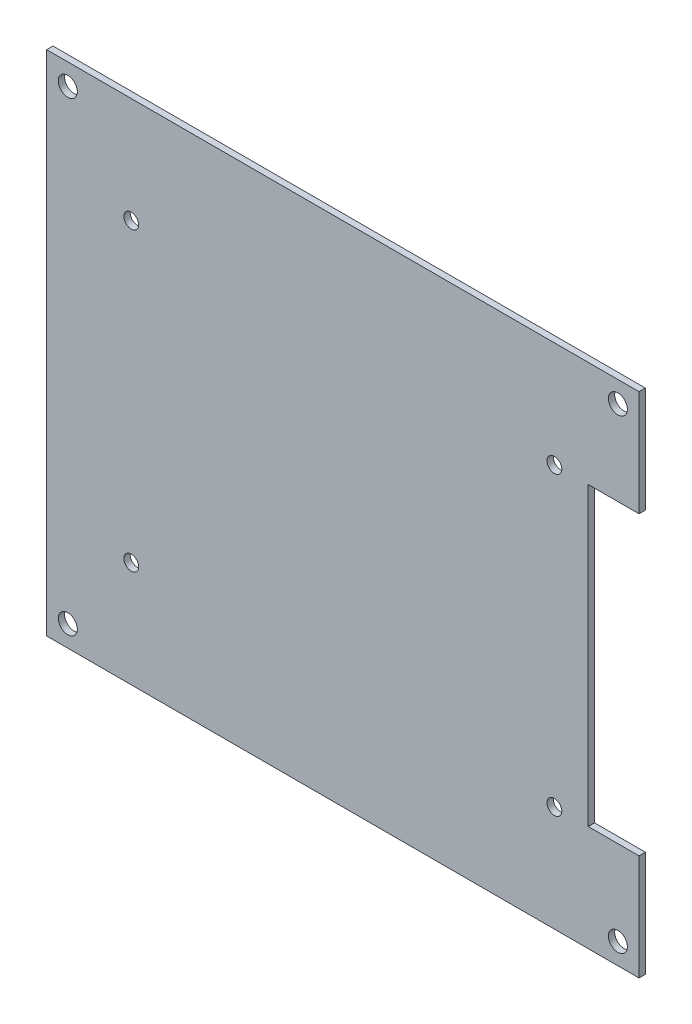
ISO-10303-21;
HEADER;
FILE_DESCRIPTION(('STEP AP214'),'2;1');
FILE_NAME('part.step','',(''),(''),'','','');
FILE_SCHEMA(('AUTOMOTIVE_DESIGN { 1 0 10303 214 1 1 1 1 }'));
ENDSEC;
DATA;
#1=APPLICATION_CONTEXT('core data for automotive mechanical design processes');
#2=APPLICATION_PROTOCOL_DEFINITION('international standard','automotive_design',2000,#1);
#3=PRODUCT_CONTEXT('',#1,'mechanical');
#4=PRODUCT('Part','Part','',(#3));
#5=PRODUCT_RELATED_PRODUCT_CATEGORY('part','',(#4));
#6=PRODUCT_DEFINITION_FORMATION('','',#4);
#7=PRODUCT_DEFINITION_CONTEXT('part definition',#1,'design');
#8=PRODUCT_DEFINITION('design','',#6,#7);
#9=PRODUCT_DEFINITION_SHAPE('','',#8);
#10=(LENGTH_UNIT() NAMED_UNIT(*) SI_UNIT(.MILLI.,.METRE.));
#11=(NAMED_UNIT(*) PLANE_ANGLE_UNIT() SI_UNIT($,.RADIAN.));
#12=(NAMED_UNIT(*) SI_UNIT($,.STERADIAN.) SOLID_ANGLE_UNIT());
#13=UNCERTAINTY_MEASURE_WITH_UNIT(LENGTH_MEASURE(1.E-05),#10,'distance_accuracy_value','');
#14=(GEOMETRIC_REPRESENTATION_CONTEXT(3) GLOBAL_UNCERTAINTY_ASSIGNED_CONTEXT((#13)) GLOBAL_UNIT_ASSIGNED_CONTEXT((#10,
#11,#12)) REPRESENTATION_CONTEXT('',''));
#15=CARTESIAN_POINT('',(0.,0.,0.));
#16=DIRECTION('',(0.,0.,1.));
#17=DIRECTION('',(1.,0.,0.));
#18=AXIS2_PLACEMENT_3D('',#15,#16,#17);
#19=CARTESIAN_POINT('',(70.,-60.,1.5));
#20=DIRECTION('',(-1.,0.,0.));
#21=DIRECTION('',(0.,-1.,0.));
#22=AXIS2_PLACEMENT_3D('',#19,#20,#21);
#23=PLANE('',#22);
#24=DIRECTION('',(0.,1.,0.));
#25=VECTOR('',#24,1.);
#26=CARTESIAN_POINT('',(70.,-60.,0.));
#27=LINE('',#26,#25);
#28=CARTESIAN_POINT('',(70.,-60.,0.));
#29=VERTEX_POINT('',#28);
#30=CARTESIAN_POINT('',(70.,-35.,0.));
#31=VERTEX_POINT('',#30);
#32=EDGE_CURVE('E193',#29,#31,#27,.T.);
#33=ORIENTED_EDGE('',*,*,#32,.T.);
#34=DIRECTION('',(0.,0.,1.));
#35=VECTOR('',#34,1.);
#36=CARTESIAN_POINT('',(70.,-35.,1.5));
#37=LINE('',#36,#35);
#38=CARTESIAN_POINT('',(70.,-35.,1.5));
#39=VERTEX_POINT('',#38);
#40=EDGE_CURVE('E38',#31,#39,#37,.T.);
#41=ORIENTED_EDGE('',*,*,#40,.T.);
#42=DIRECTION('',(0.,1.,0.));
#43=VECTOR('',#42,1.);
#44=CARTESIAN_POINT('',(70.,-60.,1.5));
#45=LINE('',#44,#43);
#46=CARTESIAN_POINT('',(70.,-60.,1.5));
#47=VERTEX_POINT('',#46);
#48=EDGE_CURVE('E184',#47,#39,#45,.T.);
#49=ORIENTED_EDGE('',*,*,#48,.F.);
#50=DIRECTION('',(0.,0.,-1.));
#51=VECTOR('',#50,1.);
#52=CARTESIAN_POINT('',(70.,-60.,1.5));
#53=LINE('',#52,#51);
#54=EDGE_CURVE('E200',#47,#29,#53,.T.);
#55=ORIENTED_EDGE('',*,*,#54,.T.);
#56=EDGE_LOOP('',(#33,#41,#49,#55));
#57=FACE_BOUND('',#56,.T.);
#58=ADVANCED_FACE('F30',(#57),#23,.F.);
#59=CARTESIAN_POINT('',(-70.,60.,1.5));
#60=DIRECTION('',(0.,0.,-1.));
#61=DIRECTION('',(-1.,0.,0.));
#62=AXIS2_PLACEMENT_3D('',#59,#60,#61);
#63=PLANE('',#62);
#64=CARTESIAN_POINT('',(50.,35.,1.5));
#65=DIRECTION('',(0.,0.,1.));
#66=DIRECTION('',(1.,0.,0.));
#67=AXIS2_PLACEMENT_3D('',#64,#65,#66);
#68=CIRCLE('',#67,1.75);
#69=CARTESIAN_POINT('',(51.75,35.,1.5));
#70=VERTEX_POINT('',#69);
#71=EDGE_CURVE('E138',#70,#70,#68,.T.);
#72=ORIENTED_EDGE('',*,*,#71,.F.);
#73=EDGE_LOOP('',(#72));
#74=FACE_BOUND('',#73,.T.);
#75=CARTESIAN_POINT('',(-50.,35.,1.5));
#76=DIRECTION('',(0.,0.,1.));
#77=DIRECTION('',(1.,0.,0.));
#78=AXIS2_PLACEMENT_3D('',#75,#76,#77);
#79=CIRCLE('',#78,1.75);
#80=CARTESIAN_POINT('',(-48.25,35.,1.5));
#81=VERTEX_POINT('',#80);
#82=EDGE_CURVE('E150',#81,#81,#79,.T.);
#83=ORIENTED_EDGE('',*,*,#82,.F.);
#84=EDGE_LOOP('',(#83));
#85=FACE_BOUND('',#84,.T.);
#86=CARTESIAN_POINT('',(65.0000000000001,-55.,1.5));
#87=DIRECTION('',(0.,0.,1.));
#88=DIRECTION('',(1.,0.,0.));
#89=AXIS2_PLACEMENT_3D('',#86,#87,#88);
#90=CIRCLE('',#89,2.25);
#91=CARTESIAN_POINT('',(67.2500000000001,-55.,1.5));
#92=VERTEX_POINT('',#91);
#93=EDGE_CURVE('E162',#92,#92,#90,.T.);
#94=ORIENTED_EDGE('',*,*,#93,.F.);
#95=EDGE_LOOP('',(#94));
#96=FACE_BOUND('',#95,.T.);
#97=CARTESIAN_POINT('',(-65.,55.,1.5));
#98=DIRECTION('',(0.,0.,1.));
#99=DIRECTION('',(1.,0.,0.));
#100=AXIS2_PLACEMENT_3D('',#97,#98,#99);
#101=CIRCLE('',#100,2.25);
#102=CARTESIAN_POINT('',(-62.75,55.,1.5));
#103=VERTEX_POINT('',#102);
#104=EDGE_CURVE('E174',#103,#103,#101,.T.);
#105=ORIENTED_EDGE('',*,*,#104,.F.);
#106=EDGE_LOOP('',(#105));
#107=FACE_BOUND('',#106,.T.);
#108=ORIENTED_EDGE('',*,*,#48,.T.);
#109=DIRECTION('',(1.,0.,0.));
#110=VECTOR('',#109,1.);
#111=CARTESIAN_POINT('',(79.1241687514701,-35.,1.5));
#112=LINE('',#111,#110);
#113=CARTESIAN_POINT('',(58.,-35.,1.5));
#114=VERTEX_POINT('',#113);
#115=EDGE_CURVE('E113',#114,#39,#112,.T.);
#116=ORIENTED_EDGE('',*,*,#115,.F.);
#117=DIRECTION('',(0.,-1.,0.));
#118=VECTOR('',#117,1.);
#119=CARTESIAN_POINT('',(58.,-35.,1.5));
#120=LINE('',#119,#118);
#121=CARTESIAN_POINT('',(58.,35.,1.5));
#122=VERTEX_POINT('',#121);
#123=EDGE_CURVE('E109',#122,#114,#120,.T.);
#124=ORIENTED_EDGE('',*,*,#123,.F.);
#125=DIRECTION('',(-1.,0.,0.));
#126=VECTOR('',#125,1.);
#127=CARTESIAN_POINT('',(79.1241687514701,35.,1.5));
#128=LINE('',#127,#126);
#129=CARTESIAN_POINT('',(70.,35.,1.5));
#130=VERTEX_POINT('',#129);
#131=EDGE_CURVE('E116',#130,#122,#128,.T.);
#132=ORIENTED_EDGE('',*,*,#131,.F.);
#133=CARTESIAN_POINT('',(70.,60.,1.5));
#134=VERTEX_POINT('',#133);
#135=EDGE_CURVE('E183',#130,#134,#45,.T.);
#136=ORIENTED_EDGE('',*,*,#135,.T.);
#137=DIRECTION('',(-1.,0.,0.));
#138=VECTOR('',#137,1.);
#139=CARTESIAN_POINT('',(-70.,60.,1.5));
#140=LINE('',#139,#138);
#141=CARTESIAN_POINT('',(-70.,60.,1.5));
#142=VERTEX_POINT('',#141);
#143=EDGE_CURVE('E54',#134,#142,#140,.T.);
#144=ORIENTED_EDGE('',*,*,#143,.T.);
#145=DIRECTION('',(0.,-1.,0.));
#146=VECTOR('',#145,1.);
#147=CARTESIAN_POINT('',(-70.,-60.,1.5));
#148=LINE('',#147,#146);
#149=CARTESIAN_POINT('',(-70.,-60.,1.5));
#150=VERTEX_POINT('',#149);
#151=EDGE_CURVE('E180',#142,#150,#148,.T.);
#152=ORIENTED_EDGE('',*,*,#151,.T.);
#153=DIRECTION('',(1.,0.,0.));
#154=VECTOR('',#153,1.);
#155=CARTESIAN_POINT('',(-70.,-60.,1.5));
#156=LINE('',#155,#154);
#157=EDGE_CURVE('E83',#150,#47,#156,.T.);
#158=ORIENTED_EDGE('',*,*,#157,.T.);
#159=EDGE_LOOP('',(#108,#116,#124,#132,#136,#144,#152,#158));
#160=FACE_BOUND('',#159,.T.);
#161=CARTESIAN_POINT('',(-65.,-55.,1.5));
#162=DIRECTION('',(0.,0.,1.));
#163=DIRECTION('',(-1.,0.,0.));
#164=AXIS2_PLACEMENT_3D('',#161,#162,#163);
#165=CIRCLE('',#164,2.25);
#166=CARTESIAN_POINT('',(-67.25,-55.,1.5));
#167=VERTEX_POINT('',#166);
#168=EDGE_CURVE('E168',#167,#167,#165,.T.);
#169=ORIENTED_EDGE('',*,*,#168,.F.);
#170=EDGE_LOOP('',(#169));
#171=FACE_BOUND('',#170,.T.);
#172=CARTESIAN_POINT('',(65.0000000000001,55.,1.5));
#173=DIRECTION('',(0.,0.,1.));
#174=DIRECTION('',(-1.,0.,0.));
#175=AXIS2_PLACEMENT_3D('',#172,#173,#174);
#176=CIRCLE('',#175,2.25);
#177=CARTESIAN_POINT('',(62.7500000000001,55.,1.5));
#178=VERTEX_POINT('',#177);
#179=EDGE_CURVE('E156',#178,#178,#176,.T.);
#180=ORIENTED_EDGE('',*,*,#179,.F.);
#181=EDGE_LOOP('',(#180));
#182=FACE_BOUND('',#181,.T.);
#183=CARTESIAN_POINT('',(-50.,-35.,1.5));
#184=DIRECTION('',(0.,0.,1.));
#185=DIRECTION('',(-1.,0.,0.));
#186=AXIS2_PLACEMENT_3D('',#183,#184,#185);
#187=CIRCLE('',#186,1.75);
#188=CARTESIAN_POINT('',(-51.75,-35.,1.5));
#189=VERTEX_POINT('',#188);
#190=EDGE_CURVE('E144',#189,#189,#187,.T.);
#191=ORIENTED_EDGE('',*,*,#190,.F.);
#192=EDGE_LOOP('',(#191));
#193=FACE_BOUND('',#192,.T.);
#194=CARTESIAN_POINT('',(50.,-35.,1.5));
#195=DIRECTION('',(0.,0.,1.));
#196=DIRECTION('',(-1.,0.,0.));
#197=AXIS2_PLACEMENT_3D('',#194,#195,#196);
#198=CIRCLE('',#197,1.75);
#199=CARTESIAN_POINT('',(48.25,-35.,1.5));
#200=VERTEX_POINT('',#199);
#201=EDGE_CURVE('E132',#200,#200,#198,.T.);
#202=ORIENTED_EDGE('',*,*,#201,.F.);
#203=EDGE_LOOP('',(#202));
#204=FACE_BOUND('',#203,.T.);
#205=ADVANCED_FACE('F122',(#74,#85,#96,#107,#160,#171,#182,#193,#204),#63,.F.);
#206=CARTESIAN_POINT('',(-70.,60.,0.));
#207=DIRECTION('',(0.,0.,-1.));
#208=DIRECTION('',(-1.,0.,0.));
#209=AXIS2_PLACEMENT_3D('',#206,#207,#208);
#210=PLANE('',#209);
#211=DIRECTION('',(-1.,0.,0.));
#212=VECTOR('',#211,1.);
#213=CARTESIAN_POINT('',(-70.,-35.,0.));
#214=LINE('',#213,#212);
#215=CARTESIAN_POINT('',(58.,-35.,0.));
#216=VERTEX_POINT('',#215);
#217=EDGE_CURVE('E129',#31,#216,#214,.T.);
#218=ORIENTED_EDGE('',*,*,#217,.F.);
#219=ORIENTED_EDGE('',*,*,#32,.F.);
#220=DIRECTION('',(1.,0.,0.));
#221=VECTOR('',#220,1.);
#222=CARTESIAN_POINT('',(-70.,-60.,0.));
#223=LINE('',#222,#221);
#224=CARTESIAN_POINT('',(-70.,-60.,0.));
#225=VERTEX_POINT('',#224);
#226=EDGE_CURVE('E190',#225,#29,#223,.T.);
#227=ORIENTED_EDGE('',*,*,#226,.F.);
#228=DIRECTION('',(0.,-1.,0.));
#229=VECTOR('',#228,1.);
#230=CARTESIAN_POINT('',(-70.,-60.,0.));
#231=LINE('',#230,#229);
#232=CARTESIAN_POINT('',(-70.,60.,0.));
#233=VERTEX_POINT('',#232);
#234=EDGE_CURVE('E177',#233,#225,#231,.T.);
#235=ORIENTED_EDGE('',*,*,#234,.F.);
#236=DIRECTION('',(-1.,0.,0.));
#237=VECTOR('',#236,1.);
#238=CARTESIAN_POINT('',(-70.,60.,0.));
#239=LINE('',#238,#237);
#240=CARTESIAN_POINT('',(70.,60.,0.));
#241=VERTEX_POINT('',#240);
#242=EDGE_CURVE('E75',#241,#233,#239,.T.);
#243=ORIENTED_EDGE('',*,*,#242,.F.);
#244=CARTESIAN_POINT('',(70.,35.,0.));
#245=VERTEX_POINT('',#244);
#246=EDGE_CURVE('E192',#245,#241,#27,.T.);
#247=ORIENTED_EDGE('',*,*,#246,.F.);
#248=DIRECTION('',(1.,0.,0.));
#249=VECTOR('',#248,1.);
#250=CARTESIAN_POINT('',(-70.,35.0000000000001,0.));
#251=LINE('',#250,#249);
#252=CARTESIAN_POINT('',(58.,35.,0.));
#253=VERTEX_POINT('',#252);
#254=EDGE_CURVE('E45',#253,#245,#251,.T.);
#255=ORIENTED_EDGE('',*,*,#254,.F.);
#256=DIRECTION('',(0.,1.,0.));
#257=VECTOR('',#256,1.);
#258=CARTESIAN_POINT('',(58.,60.,0.));
#259=LINE('',#258,#257);
#260=EDGE_CURVE('E11',#216,#253,#259,.T.);
#261=ORIENTED_EDGE('',*,*,#260,.F.);
#262=EDGE_LOOP('',(#218,#219,#227,#235,#243,#247,#255,#261));
#263=FACE_BOUND('',#262,.T.);
#264=CARTESIAN_POINT('',(50.,35.,0.));
#265=DIRECTION('',(0.,0.,1.));
#266=DIRECTION('',(1.,0.,0.));
#267=AXIS2_PLACEMENT_3D('',#264,#265,#266);
#268=CIRCLE('',#267,1.75);
#269=CARTESIAN_POINT('',(51.75,35.,0.));
#270=VERTEX_POINT('',#269);
#271=EDGE_CURVE('E135',#270,#270,#268,.T.);
#272=ORIENTED_EDGE('',*,*,#271,.T.);
#273=EDGE_LOOP('',(#272));
#274=FACE_BOUND('',#273,.T.);
#275=CARTESIAN_POINT('',(-50.,35.,0.));
#276=DIRECTION('',(0.,0.,1.));
#277=DIRECTION('',(1.,0.,0.));
#278=AXIS2_PLACEMENT_3D('',#275,#276,#277);
#279=CIRCLE('',#278,1.75);
#280=CARTESIAN_POINT('',(-48.25,35.,0.));
#281=VERTEX_POINT('',#280);
#282=EDGE_CURVE('E147',#281,#281,#279,.T.);
#283=ORIENTED_EDGE('',*,*,#282,.T.);
#284=EDGE_LOOP('',(#283));
#285=FACE_BOUND('',#284,.T.);
#286=CARTESIAN_POINT('',(65.0000000000001,-55.,0.));
#287=DIRECTION('',(0.,0.,1.));
#288=DIRECTION('',(1.,0.,0.));
#289=AXIS2_PLACEMENT_3D('',#286,#287,#288);
#290=CIRCLE('',#289,2.25);
#291=CARTESIAN_POINT('',(67.2500000000001,-55.,0.));
#292=VERTEX_POINT('',#291);
#293=EDGE_CURVE('E159',#292,#292,#290,.T.);
#294=ORIENTED_EDGE('',*,*,#293,.T.);
#295=EDGE_LOOP('',(#294));
#296=FACE_BOUND('',#295,.T.);
#297=CARTESIAN_POINT('',(-65.,55.,0.));
#298=DIRECTION('',(0.,0.,1.));
#299=DIRECTION('',(1.,0.,0.));
#300=AXIS2_PLACEMENT_3D('',#297,#298,#299);
#301=CIRCLE('',#300,2.25);
#302=CARTESIAN_POINT('',(-62.75,55.,0.));
#303=VERTEX_POINT('',#302);
#304=EDGE_CURVE('E171',#303,#303,#301,.T.);
#305=ORIENTED_EDGE('',*,*,#304,.T.);
#306=EDGE_LOOP('',(#305));
#307=FACE_BOUND('',#306,.T.);
#308=CARTESIAN_POINT('',(-65.,-55.,0.));
#309=DIRECTION('',(0.,0.,1.));
#310=DIRECTION('',(-1.,0.,0.));
#311=AXIS2_PLACEMENT_3D('',#308,#309,#310);
#312=CIRCLE('',#311,2.25);
#313=CARTESIAN_POINT('',(-67.25,-55.,0.));
#314=VERTEX_POINT('',#313);
#315=EDGE_CURVE('E165',#314,#314,#312,.T.);
#316=ORIENTED_EDGE('',*,*,#315,.T.);
#317=EDGE_LOOP('',(#316));
#318=FACE_BOUND('',#317,.T.);
#319=CARTESIAN_POINT('',(65.0000000000001,55.,0.));
#320=DIRECTION('',(0.,0.,1.));
#321=DIRECTION('',(-1.,0.,0.));
#322=AXIS2_PLACEMENT_3D('',#319,#320,#321);
#323=CIRCLE('',#322,2.25);
#324=CARTESIAN_POINT('',(62.7500000000001,55.,0.));
#325=VERTEX_POINT('',#324);
#326=EDGE_CURVE('E153',#325,#325,#323,.T.);
#327=ORIENTED_EDGE('',*,*,#326,.T.);
#328=EDGE_LOOP('',(#327));
#329=FACE_BOUND('',#328,.T.);
#330=CARTESIAN_POINT('',(-50.,-35.,0.));
#331=DIRECTION('',(0.,0.,1.));
#332=DIRECTION('',(-1.,0.,0.));
#333=AXIS2_PLACEMENT_3D('',#330,#331,#332);
#334=CIRCLE('',#333,1.75);
#335=CARTESIAN_POINT('',(-51.75,-35.,0.));
#336=VERTEX_POINT('',#335);
#337=EDGE_CURVE('E141',#336,#336,#334,.T.);
#338=ORIENTED_EDGE('',*,*,#337,.T.);
#339=EDGE_LOOP('',(#338));
#340=FACE_BOUND('',#339,.T.);
#341=CARTESIAN_POINT('',(50.,-35.,0.));
#342=DIRECTION('',(0.,0.,1.));
#343=DIRECTION('',(-1.,0.,0.));
#344=AXIS2_PLACEMENT_3D('',#341,#342,#343);
#345=CIRCLE('',#344,1.75);
#346=CARTESIAN_POINT('',(48.25,-35.,0.));
#347=VERTEX_POINT('',#346);
#348=EDGE_CURVE('E131',#347,#347,#345,.T.);
#349=ORIENTED_EDGE('',*,*,#348,.T.);
#350=EDGE_LOOP('',(#349));
#351=FACE_BOUND('',#350,.T.);
#352=ADVANCED_FACE('F215',(#263,#274,#285,#296,#307,#318,#329,#340,#351),#210,.T.);
#353=CARTESIAN_POINT('',(-70.,-60.,1.5));
#354=DIRECTION('',(1.,0.,0.));
#355=DIRECTION('',(0.,1.,0.));
#356=AXIS2_PLACEMENT_3D('',#353,#354,#355);
#357=PLANE('',#356);
#358=ORIENTED_EDGE('',*,*,#234,.T.);
#359=DIRECTION('',(0.,0.,-1.));
#360=VECTOR('',#359,1.);
#361=CARTESIAN_POINT('',(-70.,-60.,1.5));
#362=LINE('',#361,#360);
#363=EDGE_CURVE('E203',#150,#225,#362,.T.);
#364=ORIENTED_EDGE('',*,*,#363,.F.);
#365=ORIENTED_EDGE('',*,*,#151,.F.);
#366=DIRECTION('',(0.,0.,-1.));
#367=VECTOR('',#366,1.);
#368=CARTESIAN_POINT('',(-70.,60.,1.5));
#369=LINE('',#368,#367);
#370=EDGE_CURVE('E187',#142,#233,#369,.T.);
#371=ORIENTED_EDGE('',*,*,#370,.T.);
#372=EDGE_LOOP('',(#358,#364,#365,#371));
#373=FACE_BOUND('',#372,.T.);
#374=ADVANCED_FACE('F32',(#373),#357,.F.);
#375=CARTESIAN_POINT('',(-70.,-60.,1.5));
#376=DIRECTION('',(0.,1.,0.));
#377=DIRECTION('',(-1.,0.,0.));
#378=AXIS2_PLACEMENT_3D('',#375,#376,#377);
#379=PLANE('',#378);
#380=ORIENTED_EDGE('',*,*,#226,.T.);
#381=ORIENTED_EDGE('',*,*,#54,.F.);
#382=ORIENTED_EDGE('',*,*,#157,.F.);
#383=ORIENTED_EDGE('',*,*,#363,.T.);
#384=EDGE_LOOP('',(#380,#381,#382,#383));
#385=FACE_BOUND('',#384,.T.);
#386=ADVANCED_FACE('F213',(#385),#379,.F.);
#387=ORIENTED_EDGE('',*,*,#135,.F.);
#388=DIRECTION('',(0.,0.,-1.));
#389=VECTOR('',#388,1.);
#390=CARTESIAN_POINT('',(70.,35.,1.5));
#391=LINE('',#390,#389);
#392=EDGE_CURVE('E118',#130,#245,#391,.T.);
#393=ORIENTED_EDGE('',*,*,#392,.T.);
#394=ORIENTED_EDGE('',*,*,#246,.T.);
#395=DIRECTION('',(0.,0.,-1.));
#396=VECTOR('',#395,1.);
#397=CARTESIAN_POINT('',(70.,60.,1.5));
#398=LINE('',#397,#396);
#399=EDGE_CURVE('E198',#134,#241,#398,.T.);
#400=ORIENTED_EDGE('',*,*,#399,.F.);
#401=EDGE_LOOP('',(#387,#393,#394,#400));
#402=FACE_BOUND('',#401,.T.);
#403=ADVANCED_FACE('F232',(#402),#23,.F.);
#404=CARTESIAN_POINT('',(-70.,60.,1.5));
#405=DIRECTION('',(0.,-1.,0.));
#406=DIRECTION('',(1.,0.,0.));
#407=AXIS2_PLACEMENT_3D('',#404,#405,#406);
#408=PLANE('',#407);
#409=ORIENTED_EDGE('',*,*,#242,.T.);
#410=ORIENTED_EDGE('',*,*,#370,.F.);
#411=ORIENTED_EDGE('',*,*,#143,.F.);
#412=ORIENTED_EDGE('',*,*,#399,.T.);
#413=EDGE_LOOP('',(#409,#410,#411,#412));
#414=FACE_BOUND('',#413,.T.);
#415=ADVANCED_FACE('F240',(#414),#408,.F.);
#416=CARTESIAN_POINT('',(-65.,55.,1.5));
#417=DIRECTION('',(0.,0.,-1.));
#418=DIRECTION('',(-1.,0.,0.));
#419=AXIS2_PLACEMENT_3D('',#416,#417,#418);
#420=CYLINDRICAL_SURFACE('',#419,2.25);
#421=ORIENTED_EDGE('',*,*,#104,.T.);
#422=EDGE_LOOP('',(#421));
#423=FACE_BOUND('',#422,.T.);
#424=ORIENTED_EDGE('',*,*,#304,.F.);
#425=EDGE_LOOP('',(#424));
#426=FACE_BOUND('',#425,.T.);
#427=ADVANCED_FACE('F246',(#423,#426),#420,.F.);
#428=CARTESIAN_POINT('',(-65.,-55.,1.5));
#429=DIRECTION('',(0.,0.,-1.));
#430=DIRECTION('',(-1.,0.,0.));
#431=AXIS2_PLACEMENT_3D('',#428,#429,#430);
#432=CYLINDRICAL_SURFACE('',#431,2.25);
#433=ORIENTED_EDGE('',*,*,#168,.T.);
#434=EDGE_LOOP('',(#433));
#435=FACE_BOUND('',#434,.T.);
#436=ORIENTED_EDGE('',*,*,#315,.F.);
#437=EDGE_LOOP('',(#436));
#438=FACE_BOUND('',#437,.T.);
#439=ADVANCED_FACE('F260',(#435,#438),#432,.F.);
#440=CARTESIAN_POINT('',(65.0000000000001,-55.,1.5));
#441=DIRECTION('',(0.,0.,-1.));
#442=DIRECTION('',(-1.,0.,0.));
#443=AXIS2_PLACEMENT_3D('',#440,#441,#442);
#444=CYLINDRICAL_SURFACE('',#443,2.25);
#445=ORIENTED_EDGE('',*,*,#93,.T.);
#446=EDGE_LOOP('',(#445));
#447=FACE_BOUND('',#446,.T.);
#448=ORIENTED_EDGE('',*,*,#293,.F.);
#449=EDGE_LOOP('',(#448));
#450=FACE_BOUND('',#449,.T.);
#451=ADVANCED_FACE('F264',(#447,#450),#444,.F.);
#452=CARTESIAN_POINT('',(65.0000000000001,55.,1.5));
#453=DIRECTION('',(0.,0.,-1.));
#454=DIRECTION('',(-1.,0.,0.));
#455=AXIS2_PLACEMENT_3D('',#452,#453,#454);
#456=CYLINDRICAL_SURFACE('',#455,2.25);
#457=ORIENTED_EDGE('',*,*,#179,.T.);
#458=EDGE_LOOP('',(#457));
#459=FACE_BOUND('',#458,.T.);
#460=ORIENTED_EDGE('',*,*,#326,.F.);
#461=EDGE_LOOP('',(#460));
#462=FACE_BOUND('',#461,.T.);
#463=ADVANCED_FACE('F268',(#459,#462),#456,.F.);
#464=CARTESIAN_POINT('',(-50.,35.,1.5));
#465=DIRECTION('',(0.,0.,-1.));
#466=DIRECTION('',(-1.,0.,0.));
#467=AXIS2_PLACEMENT_3D('',#464,#465,#466);
#468=CYLINDRICAL_SURFACE('',#467,1.75);
#469=ORIENTED_EDGE('',*,*,#82,.T.);
#470=EDGE_LOOP('',(#469));
#471=FACE_BOUND('',#470,.T.);
#472=ORIENTED_EDGE('',*,*,#282,.F.);
#473=EDGE_LOOP('',(#472));
#474=FACE_BOUND('',#473,.T.);
#475=ADVANCED_FACE('F272',(#471,#474),#468,.F.);
#476=CARTESIAN_POINT('',(-50.,-35.,1.5));
#477=DIRECTION('',(0.,0.,-1.));
#478=DIRECTION('',(-1.,0.,0.));
#479=AXIS2_PLACEMENT_3D('',#476,#477,#478);
#480=CYLINDRICAL_SURFACE('',#479,1.75);
#481=ORIENTED_EDGE('',*,*,#190,.T.);
#482=EDGE_LOOP('',(#481));
#483=FACE_BOUND('',#482,.T.);
#484=ORIENTED_EDGE('',*,*,#337,.F.);
#485=EDGE_LOOP('',(#484));
#486=FACE_BOUND('',#485,.T.);
#487=ADVANCED_FACE('F276',(#483,#486),#480,.F.);
#488=CARTESIAN_POINT('',(50.,35.,1.5));
#489=DIRECTION('',(0.,0.,-1.));
#490=DIRECTION('',(-1.,0.,0.));
#491=AXIS2_PLACEMENT_3D('',#488,#489,#490);
#492=CYLINDRICAL_SURFACE('',#491,1.75);
#493=ORIENTED_EDGE('',*,*,#71,.T.);
#494=EDGE_LOOP('',(#493));
#495=FACE_BOUND('',#494,.T.);
#496=ORIENTED_EDGE('',*,*,#271,.F.);
#497=EDGE_LOOP('',(#496));
#498=FACE_BOUND('',#497,.T.);
#499=ADVANCED_FACE('F227',(#495,#498),#492,.F.);
#500=CARTESIAN_POINT('',(50.,-35.,1.5));
#501=DIRECTION('',(0.,0.,-1.));
#502=DIRECTION('',(-1.,0.,0.));
#503=AXIS2_PLACEMENT_3D('',#500,#501,#502);
#504=CYLINDRICAL_SURFACE('',#503,1.75);
#505=ORIENTED_EDGE('',*,*,#201,.T.);
#506=EDGE_LOOP('',(#505));
#507=FACE_BOUND('',#506,.T.);
#508=ORIENTED_EDGE('',*,*,#348,.F.);
#509=EDGE_LOOP('',(#508));
#510=FACE_BOUND('',#509,.T.);
#511=ADVANCED_FACE('F220',(#507,#510),#504,.F.);
#512=CARTESIAN_POINT('',(79.1241687514701,-35.,-8.5));
#513=DIRECTION('',(0.,-1.,0.));
#514=DIRECTION('',(0.,0.,-1.));
#515=AXIS2_PLACEMENT_3D('',#512,#513,#514);
#516=PLANE('',#515);
#517=ORIENTED_EDGE('',*,*,#217,.T.);
#518=DIRECTION('',(0.,0.,1.));
#519=VECTOR('',#518,1.);
#520=CARTESIAN_POINT('',(58.,-35.,-8.5));
#521=LINE('',#520,#519);
#522=EDGE_CURVE('E112',#216,#114,#521,.T.);
#523=ORIENTED_EDGE('',*,*,#522,.T.);
#524=ORIENTED_EDGE('',*,*,#115,.T.);
#525=ORIENTED_EDGE('',*,*,#40,.F.);
#526=EDGE_LOOP('',(#517,#523,#524,#525));
#527=FACE_BOUND('',#526,.T.);
#528=ADVANCED_FACE('F218',(#527),#516,.F.);
#529=CARTESIAN_POINT('',(58.,-35.,-8.5));
#530=DIRECTION('',(-1.,0.,0.));
#531=DIRECTION('',(0.,-1.,0.));
#532=AXIS2_PLACEMENT_3D('',#529,#530,#531);
#533=PLANE('',#532);
#534=ORIENTED_EDGE('',*,*,#260,.T.);
#535=DIRECTION('',(0.,0.,1.));
#536=VECTOR('',#535,1.);
#537=CARTESIAN_POINT('',(58.,35.,-8.5));
#538=LINE('',#537,#536);
#539=EDGE_CURVE('E104',#253,#122,#538,.T.);
#540=ORIENTED_EDGE('',*,*,#539,.T.);
#541=ORIENTED_EDGE('',*,*,#123,.T.);
#542=ORIENTED_EDGE('',*,*,#522,.F.);
#543=EDGE_LOOP('',(#534,#540,#541,#542));
#544=FACE_BOUND('',#543,.T.);
#545=ADVANCED_FACE('F106',(#544),#533,.F.);
#546=CARTESIAN_POINT('',(79.1241687514701,35.,-8.5));
#547=DIRECTION('',(0.,1.,0.));
#548=DIRECTION('',(-1.,0.,0.));
#549=AXIS2_PLACEMENT_3D('',#546,#547,#548);
#550=PLANE('',#549);
#551=ORIENTED_EDGE('',*,*,#254,.T.);
#552=ORIENTED_EDGE('',*,*,#392,.F.);
#553=ORIENTED_EDGE('',*,*,#131,.T.);
#554=ORIENTED_EDGE('',*,*,#539,.F.);
#555=EDGE_LOOP('',(#551,#552,#553,#554));
#556=FACE_BOUND('',#555,.T.);
#557=ADVANCED_FACE('F117',(#556),#550,.F.);
#558=CLOSED_SHELL('',(#58,#205,#352,#374,#386,#403,#415,#427,#439,#451,#463,#475,#487,#499,#511,
#528,#545,#557));
#559=MANIFOLD_SOLID_BREP('B2',#558);
#560=ADVANCED_BREP_SHAPE_REPRESENTATION('',(#18,#559),#14);
#561=SHAPE_DEFINITION_REPRESENTATION(#9,#560);
ENDSEC;
END-ISO-10303-21;
